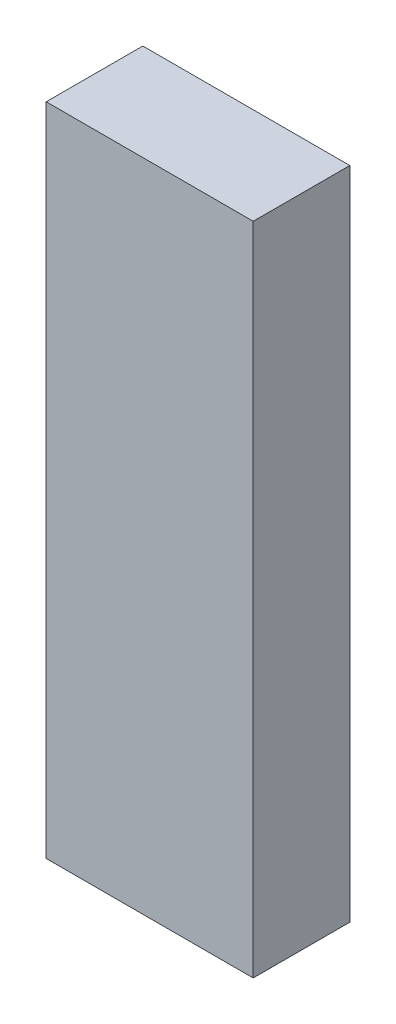
ISO-10303-21;
HEADER;
FILE_DESCRIPTION(('STEP AP214'),'2;1');
FILE_NAME('part.step','',(''),(''),'','','');
FILE_SCHEMA(('AUTOMOTIVE_DESIGN { 1 0 10303 214 1 1 1 1 }'));
ENDSEC;
DATA;
#1=APPLICATION_CONTEXT('core data for automotive mechanical design processes');
#2=APPLICATION_PROTOCOL_DEFINITION('international standard','automotive_design',2000,#1);
#3=PRODUCT_CONTEXT('',#1,'mechanical');
#4=PRODUCT('Part','Part','',(#3));
#5=PRODUCT_RELATED_PRODUCT_CATEGORY('part','',(#4));
#6=PRODUCT_DEFINITION_FORMATION('','',#4);
#7=PRODUCT_DEFINITION_CONTEXT('part definition',#1,'design');
#8=PRODUCT_DEFINITION('design','',#6,#7);
#9=PRODUCT_DEFINITION_SHAPE('','',#8);
#10=(LENGTH_UNIT() NAMED_UNIT(*) SI_UNIT(.MILLI.,.METRE.));
#11=(NAMED_UNIT(*) PLANE_ANGLE_UNIT() SI_UNIT($,.RADIAN.));
#12=(NAMED_UNIT(*) SI_UNIT($,.STERADIAN.) SOLID_ANGLE_UNIT());
#13=UNCERTAINTY_MEASURE_WITH_UNIT(LENGTH_MEASURE(1.E-05),#10,'distance_accuracy_value','');
#14=(GEOMETRIC_REPRESENTATION_CONTEXT(3) GLOBAL_UNCERTAINTY_ASSIGNED_CONTEXT((#13)) GLOBAL_UNIT_ASSIGNED_CONTEXT((#10,
#11,#12)) REPRESENTATION_CONTEXT('',''));
#15=CARTESIAN_POINT('',(0.,0.,0.));
#16=DIRECTION('',(0.,0.,1.));
#17=DIRECTION('',(1.,0.,0.));
#18=AXIS2_PLACEMENT_3D('',#15,#16,#17);
#19=CARTESIAN_POINT('',(187.5,1187.25,87.5));
#20=DIRECTION('',(-1.,0.,0.));
#21=DIRECTION('',(0.,0.,1.));
#22=AXIS2_PLACEMENT_3D('',#19,#20,#21);
#23=PLANE('',#22);
#24=DIRECTION('',(0.,0.,-1.));
#25=VECTOR('',#24,1.);
#26=CARTESIAN_POINT('',(187.5,0.,87.5));
#27=LINE('',#26,#25);
#28=CARTESIAN_POINT('',(187.5,0.,87.5));
#29=VERTEX_POINT('',#28);
#30=CARTESIAN_POINT('',(187.5,0.,-87.5));
#31=VERTEX_POINT('',#30);
#32=EDGE_CURVE('E106',#29,#31,#27,.T.);
#33=ORIENTED_EDGE('',*,*,#32,.T.);
#34=DIRECTION('',(0.,-1.,0.));
#35=VECTOR('',#34,1.);
#36=CARTESIAN_POINT('',(187.5,1187.25,-87.5));
#37=LINE('',#36,#35);
#38=CARTESIAN_POINT('',(187.5,1187.25,-87.5));
#39=VERTEX_POINT('',#38);
#40=EDGE_CURVE('E11',#39,#31,#37,.T.);
#41=ORIENTED_EDGE('',*,*,#40,.F.);
#42=DIRECTION('',(0.,0.,-1.));
#43=VECTOR('',#42,1.);
#44=CARTESIAN_POINT('',(187.5,1187.25,87.5));
#45=LINE('',#44,#43);
#46=CARTESIAN_POINT('',(187.5,1187.25,87.5));
#47=VERTEX_POINT('',#46);
#48=EDGE_CURVE('E94',#47,#39,#45,.T.);
#49=ORIENTED_EDGE('',*,*,#48,.F.);
#50=DIRECTION('',(0.,-1.,0.));
#51=VECTOR('',#50,1.);
#52=CARTESIAN_POINT('',(187.5,1187.25,87.5));
#53=LINE('',#52,#51);
#54=EDGE_CURVE('E102',#47,#29,#53,.T.);
#55=ORIENTED_EDGE('',*,*,#54,.T.);
#56=EDGE_LOOP('',(#33,#41,#49,#55));
#57=FACE_BOUND('',#56,.T.);
#58=ADVANCED_FACE('F43',(#57),#23,.F.);
#59=CARTESIAN_POINT('',(-187.5,1187.25,-87.5));
#60=DIRECTION('',(0.,0.,1.));
#61=DIRECTION('',(1.,0.,0.));
#62=AXIS2_PLACEMENT_3D('',#59,#60,#61);
#63=PLANE('',#62);
#64=DIRECTION('',(-1.,0.,0.));
#65=VECTOR('',#64,1.);
#66=CARTESIAN_POINT('',(-187.5,0.,-87.5));
#67=LINE('',#66,#65);
#68=CARTESIAN_POINT('',(-187.5,0.,-87.5));
#69=VERTEX_POINT('',#68);
#70=EDGE_CURVE('E98',#31,#69,#67,.T.);
#71=ORIENTED_EDGE('',*,*,#70,.T.);
#72=DIRECTION('',(0.,-1.,0.));
#73=VECTOR('',#72,1.);
#74=CARTESIAN_POINT('',(-187.5,1187.25,-87.5));
#75=LINE('',#74,#73);
#76=CARTESIAN_POINT('',(-187.5,1187.25,-87.5));
#77=VERTEX_POINT('',#76);
#78=EDGE_CURVE('E51',#77,#69,#75,.T.);
#79=ORIENTED_EDGE('',*,*,#78,.F.);
#80=DIRECTION('',(-1.,0.,0.));
#81=VECTOR('',#80,1.);
#82=CARTESIAN_POINT('',(-187.5,1187.25,-87.5));
#83=LINE('',#82,#81);
#84=EDGE_CURVE('E89',#39,#77,#83,.T.);
#85=ORIENTED_EDGE('',*,*,#84,.F.);
#86=ORIENTED_EDGE('',*,*,#40,.T.);
#87=EDGE_LOOP('',(#71,#79,#85,#86));
#88=FACE_BOUND('',#87,.T.);
#89=ADVANCED_FACE('F97',(#88),#63,.F.);
#90=CARTESIAN_POINT('',(-187.5,1187.25,87.5));
#91=DIRECTION('',(1.,0.,0.));
#92=DIRECTION('',(0.,0.,-1.));
#93=AXIS2_PLACEMENT_3D('',#90,#91,#92);
#94=PLANE('',#93);
#95=DIRECTION('',(0.,0.,1.));
#96=VECTOR('',#95,1.);
#97=CARTESIAN_POINT('',(-187.5,0.,87.5));
#98=LINE('',#97,#96);
#99=CARTESIAN_POINT('',(-187.5,0.,87.5));
#100=VERTEX_POINT('',#99);
#101=EDGE_CURVE('E76',#69,#100,#98,.T.);
#102=ORIENTED_EDGE('',*,*,#101,.T.);
#103=DIRECTION('',(0.,-1.,0.));
#104=VECTOR('',#103,1.);
#105=CARTESIAN_POINT('',(-187.5,1187.25,87.5));
#106=LINE('',#105,#104);
#107=CARTESIAN_POINT('',(-187.5,1187.25,87.5));
#108=VERTEX_POINT('',#107);
#109=EDGE_CURVE('E99',#108,#100,#106,.T.);
#110=ORIENTED_EDGE('',*,*,#109,.F.);
#111=DIRECTION('',(0.,0.,1.));
#112=VECTOR('',#111,1.);
#113=CARTESIAN_POINT('',(-187.5,1187.25,87.5));
#114=LINE('',#113,#112);
#115=EDGE_CURVE('E92',#77,#108,#114,.T.);
#116=ORIENTED_EDGE('',*,*,#115,.F.);
#117=ORIENTED_EDGE('',*,*,#78,.T.);
#118=EDGE_LOOP('',(#102,#110,#116,#117));
#119=FACE_BOUND('',#118,.T.);
#120=ADVANCED_FACE('F100',(#119),#94,.F.);
#121=CARTESIAN_POINT('',(-187.5,1187.25,87.5));
#122=DIRECTION('',(0.,0.,-1.));
#123=DIRECTION('',(-1.,0.,0.));
#124=AXIS2_PLACEMENT_3D('',#121,#122,#123);
#125=PLANE('',#124);
#126=DIRECTION('',(1.,0.,0.));
#127=VECTOR('',#126,1.);
#128=CARTESIAN_POINT('',(-187.5,0.,87.5));
#129=LINE('',#128,#127);
#130=EDGE_CURVE('E82',#100,#29,#129,.T.);
#131=ORIENTED_EDGE('',*,*,#130,.T.);
#132=ORIENTED_EDGE('',*,*,#54,.F.);
#133=DIRECTION('',(1.,0.,0.));
#134=VECTOR('',#133,1.);
#135=CARTESIAN_POINT('',(-187.5,1187.25,87.5));
#136=LINE('',#135,#134);
#137=EDGE_CURVE('E59',#108,#47,#136,.T.);
#138=ORIENTED_EDGE('',*,*,#137,.F.);
#139=ORIENTED_EDGE('',*,*,#109,.T.);
#140=EDGE_LOOP('',(#131,#132,#138,#139));
#141=FACE_BOUND('',#140,.T.);
#142=ADVANCED_FACE('F113',(#141),#125,.F.);
#143=CARTESIAN_POINT('',(0.,1187.25,0.));
#144=DIRECTION('',(0.,-1.,0.));
#145=DIRECTION('',(0.,0.,-1.));
#146=AXIS2_PLACEMENT_3D('',#143,#144,#145);
#147=PLANE('',#146);
#148=ORIENTED_EDGE('',*,*,#48,.T.);
#149=ORIENTED_EDGE('',*,*,#84,.T.);
#150=ORIENTED_EDGE('',*,*,#115,.T.);
#151=ORIENTED_EDGE('',*,*,#137,.T.);
#152=EDGE_LOOP('',(#148,#149,#150,#151));
#153=FACE_BOUND('',#152,.T.);
#154=ADVANCED_FACE('F90',(#153),#147,.F.);
#155=CARTESIAN_POINT('',(0.,0.,0.));
#156=DIRECTION('',(0.,-1.,0.));
#157=DIRECTION('',(0.,0.,-1.));
#158=AXIS2_PLACEMENT_3D('',#155,#156,#157);
#159=PLANE('',#158);
#160=ORIENTED_EDGE('',*,*,#32,.F.);
#161=ORIENTED_EDGE('',*,*,#130,.F.);
#162=ORIENTED_EDGE('',*,*,#101,.F.);
#163=ORIENTED_EDGE('',*,*,#70,.F.);
#164=EDGE_LOOP('',(#160,#161,#162,#163));
#165=FACE_BOUND('',#164,.T.);
#166=ADVANCED_FACE('F116',(#165),#159,.T.);
#167=CLOSED_SHELL('',(#58,#89,#120,#142,#154,#166));
#168=MANIFOLD_SOLID_BREP('B2',#167);
#169=ADVANCED_BREP_SHAPE_REPRESENTATION('',(#18,#168),#14);
#170=SHAPE_DEFINITION_REPRESENTATION(#9,#169);
ENDSEC;
END-ISO-10303-21;
